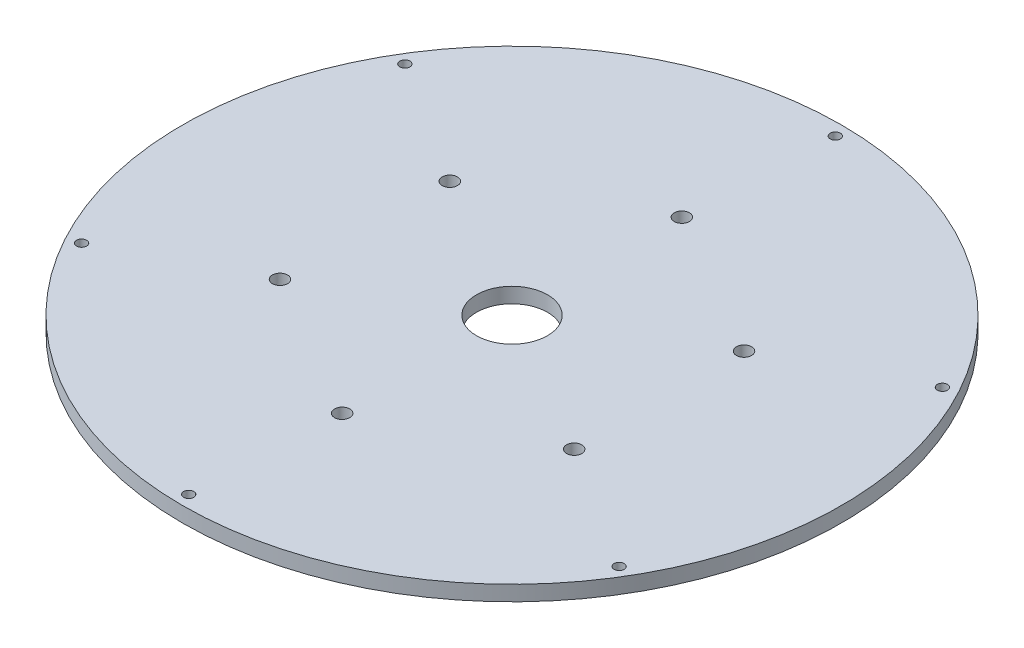
ISO-10303-21;
HEADER;
FILE_DESCRIPTION(('STEP AP214'),'2;1');
FILE_NAME('part.step','',(''),(''),'','','');
FILE_SCHEMA(('AUTOMOTIVE_DESIGN { 1 0 10303 214 1 1 1 1 }'));
ENDSEC;
DATA;
#1=APPLICATION_CONTEXT('core data for automotive mechanical design processes');
#2=APPLICATION_PROTOCOL_DEFINITION('international standard','automotive_design',2000,#1);
#3=PRODUCT_CONTEXT('',#1,'mechanical');
#4=PRODUCT('Part','Part','',(#3));
#5=PRODUCT_RELATED_PRODUCT_CATEGORY('part','',(#4));
#6=PRODUCT_DEFINITION_FORMATION('','',#4);
#7=PRODUCT_DEFINITION_CONTEXT('part definition',#1,'design');
#8=PRODUCT_DEFINITION('design','',#6,#7);
#9=PRODUCT_DEFINITION_SHAPE('','',#8);
#10=(LENGTH_UNIT() NAMED_UNIT(*) SI_UNIT(.MILLI.,.METRE.));
#11=(NAMED_UNIT(*) PLANE_ANGLE_UNIT() SI_UNIT($,.RADIAN.));
#12=(NAMED_UNIT(*) SI_UNIT($,.STERADIAN.) SOLID_ANGLE_UNIT());
#13=UNCERTAINTY_MEASURE_WITH_UNIT(LENGTH_MEASURE(1.E-05),#10,'distance_accuracy_value','');
#14=(GEOMETRIC_REPRESENTATION_CONTEXT(3) GLOBAL_UNCERTAINTY_ASSIGNED_CONTEXT((#13)) GLOBAL_UNIT_ASSIGNED_CONTEXT((#10,
#11,#12)) REPRESENTATION_CONTEXT('',''));
#15=CARTESIAN_POINT('',(0.,0.,0.));
#16=DIRECTION('',(0.,0.,1.));
#17=DIRECTION('',(1.,0.,0.));
#18=AXIS2_PLACEMENT_3D('',#15,#16,#17);
#19=CARTESIAN_POINT('',(0.,3.,0.));
#20=DIRECTION('',(0.,-1.,0.));
#21=DIRECTION('',(0.,0.,-1.));
#22=AXIS2_PLACEMENT_3D('',#19,#20,#21);
#23=CYLINDRICAL_SURFACE('',#22,65.);
#24=CARTESIAN_POINT('',(0.,3.,0.));
#25=DIRECTION('',(0.,1.,0.));
#26=DIRECTION('',(0.,0.,1.));
#27=AXIS2_PLACEMENT_3D('',#24,#25,#26);
#28=CIRCLE('',#27,65.);
#29=CARTESIAN_POINT('',(0.,3.,65.));
#30=VERTEX_POINT('',#29);
#31=EDGE_CURVE('E10',#30,#30,#28,.T.);
#32=ORIENTED_EDGE('',*,*,#31,.F.);
#33=EDGE_LOOP('',(#32));
#34=FACE_BOUND('',#33,.T.);
#35=CARTESIAN_POINT('',(0.,0.,0.));
#36=DIRECTION('',(0.,1.,0.));
#37=DIRECTION('',(0.,0.,1.));
#38=AXIS2_PLACEMENT_3D('',#35,#36,#37);
#39=CIRCLE('',#38,65.);
#40=CARTESIAN_POINT('',(0.,0.,65.));
#41=VERTEX_POINT('',#40);
#42=EDGE_CURVE('E37',#41,#41,#39,.T.);
#43=ORIENTED_EDGE('',*,*,#42,.T.);
#44=EDGE_LOOP('',(#43));
#45=FACE_BOUND('',#44,.T.);
#46=ADVANCED_FACE('F30',(#34,#45),#23,.T.);
#47=CARTESIAN_POINT('',(0.,3.,0.));
#48=DIRECTION('',(0.,1.,0.));
#49=DIRECTION('',(0.,0.,1.));
#50=AXIS2_PLACEMENT_3D('',#47,#48,#49);
#51=PLANE('',#50);
#52=CARTESIAN_POINT('',(-29.0118510267787,3.,-16.75));
#53=DIRECTION('',(0.,1.,0.));
#54=DIRECTION('',(0.,0.,1.));
#55=AXIS2_PLACEMENT_3D('',#52,#53,#54);
#56=CIRCLE('',#55,1.5);
#57=CARTESIAN_POINT('',(-29.0118510267787,3.,-15.25));
#58=VERTEX_POINT('',#57);
#59=EDGE_CURVE('E76',#58,#58,#56,.T.);
#60=ORIENTED_EDGE('',*,*,#59,.F.);
#61=EDGE_LOOP('',(#60));
#62=FACE_BOUND('',#61,.T.);
#63=CARTESIAN_POINT('',(-29.0118510267787,3.,16.75));
#64=DIRECTION('',(0.,1.,0.));
#65=DIRECTION('',(0.,0.,1.));
#66=AXIS2_PLACEMENT_3D('',#63,#64,#65);
#67=CIRCLE('',#66,1.5);
#68=CARTESIAN_POINT('',(-29.0118510267787,3.,18.25));
#69=VERTEX_POINT('',#68);
#70=EDGE_CURVE('E66',#69,#69,#67,.T.);
#71=ORIENTED_EDGE('',*,*,#70,.F.);
#72=EDGE_LOOP('',(#71));
#73=FACE_BOUND('',#72,.T.);
#74=CARTESIAN_POINT('',(0.,3.,33.5));
#75=DIRECTION('',(0.,1.,0.));
#76=DIRECTION('',(0.,0.,1.));
#77=AXIS2_PLACEMENT_3D('',#74,#75,#76);
#78=CIRCLE('',#77,1.5);
#79=CARTESIAN_POINT('',(0.,3.,35.));
#80=VERTEX_POINT('',#79);
#81=EDGE_CURVE('E63',#80,#80,#78,.T.);
#82=ORIENTED_EDGE('',*,*,#81,.F.);
#83=EDGE_LOOP('',(#82));
#84=FACE_BOUND('',#83,.T.);
#85=CARTESIAN_POINT('',(29.0118510267787,3.,16.75));
#86=DIRECTION('',(0.,1.,0.));
#87=DIRECTION('',(0.,0.,1.));
#88=AXIS2_PLACEMENT_3D('',#85,#86,#87);
#89=CIRCLE('',#88,1.5);
#90=CARTESIAN_POINT('',(29.0118510267787,3.,18.25));
#91=VERTEX_POINT('',#90);
#92=EDGE_CURVE('E60',#91,#91,#89,.T.);
#93=ORIENTED_EDGE('',*,*,#92,.F.);
#94=EDGE_LOOP('',(#93));
#95=FACE_BOUND('',#94,.T.);
#96=CARTESIAN_POINT('',(29.0118510267787,3.,-16.75));
#97=DIRECTION('',(0.,1.,0.));
#98=DIRECTION('',(0.,0.,1.));
#99=AXIS2_PLACEMENT_3D('',#96,#97,#98);
#100=CIRCLE('',#99,1.5);
#101=CARTESIAN_POINT('',(29.0118510267787,3.,-15.25));
#102=VERTEX_POINT('',#101);
#103=EDGE_CURVE('E56',#102,#102,#100,.T.);
#104=ORIENTED_EDGE('',*,*,#103,.F.);
#105=EDGE_LOOP('',(#104));
#106=FACE_BOUND('',#105,.T.);
#107=CARTESIAN_POINT('',(0.,3.,-33.5));
#108=DIRECTION('',(0.,1.,0.));
#109=DIRECTION('',(0.,0.,1.));
#110=AXIS2_PLACEMENT_3D('',#107,#108,#109);
#111=CIRCLE('',#110,1.5);
#112=CARTESIAN_POINT('',(0.,3.,-32.));
#113=VERTEX_POINT('',#112);
#114=EDGE_CURVE('E52',#113,#113,#111,.T.);
#115=ORIENTED_EDGE('',*,*,#114,.F.);
#116=EDGE_LOOP('',(#115));
#117=FACE_BOUND('',#116,.T.);
#118=CARTESIAN_POINT('',(0.,3.,0.));
#119=DIRECTION('',(0.,1.,0.));
#120=DIRECTION('',(0.,0.,1.));
#121=AXIS2_PLACEMENT_3D('',#118,#119,#120);
#122=CIRCLE('',#121,7.);
#123=CARTESIAN_POINT('',(0.,3.,7.));
#124=VERTEX_POINT('',#123);
#125=EDGE_CURVE('E51',#124,#124,#122,.T.);
#126=ORIENTED_EDGE('',*,*,#125,.F.);
#127=EDGE_LOOP('',(#126));
#128=FACE_BOUND('',#127,.T.);
#129=CARTESIAN_POINT('',(1.27880200091845,3.,-62.4869159540015));
#130=DIRECTION('',(0.,1.,0.));
#131=DIRECTION('',(0.,0.,1.));
#132=AXIS2_PLACEMENT_3D('',#129,#130,#131);
#133=CIRCLE('',#132,1.);
#134=CARTESIAN_POINT('',(1.27880200091845,3.,-61.4869159540015));
#135=VERTEX_POINT('',#134);
#136=EDGE_CURVE('E88',#135,#135,#133,.T.);
#137=ORIENTED_EDGE('',*,*,#136,.F.);
#138=EDGE_LOOP('',(#137));
#139=FACE_BOUND('',#138,.T.);
#140=CARTESIAN_POINT('',(54.7546576207677,3.,-30.135982957795));
#141=DIRECTION('',(0.,1.,0.));
#142=DIRECTION('',(0.,0.,1.));
#143=AXIS2_PLACEMENT_3D('',#140,#141,#142);
#144=CIRCLE('',#143,0.999999999999998);
#145=CARTESIAN_POINT('',(54.7546576207677,3.,-29.135982957795));
#146=VERTEX_POINT('',#145);
#147=EDGE_CURVE('E94',#146,#146,#144,.T.);
#148=ORIENTED_EDGE('',*,*,#147,.F.);
#149=EDGE_LOOP('',(#148));
#150=FACE_BOUND('',#149,.T.);
#151=CARTESIAN_POINT('',(53.4758556198492,3.,32.3509329962065));
#152=DIRECTION('',(0.,1.,0.));
#153=DIRECTION('',(0.,0.,1.));
#154=AXIS2_PLACEMENT_3D('',#151,#152,#153);
#155=CIRCLE('',#154,0.999999999999998);
#156=CARTESIAN_POINT('',(53.4758556198492,3.,33.3509329962065));
#157=VERTEX_POINT('',#156);
#158=EDGE_CURVE('E100',#157,#157,#155,.T.);
#159=ORIENTED_EDGE('',*,*,#158,.F.);
#160=EDGE_LOOP('',(#159));
#161=FACE_BOUND('',#160,.T.);
#162=CARTESIAN_POINT('',(-1.27880200091843,3.,62.4869159540015));
#163=DIRECTION('',(0.,1.,0.));
#164=DIRECTION('',(0.,0.,1.));
#165=AXIS2_PLACEMENT_3D('',#162,#163,#164);
#166=CIRCLE('',#165,1.);
#167=CARTESIAN_POINT('',(-1.27880200091843,3.,63.4869159540015));
#168=VERTEX_POINT('',#167);
#169=EDGE_CURVE('E106',#168,#168,#166,.T.);
#170=ORIENTED_EDGE('',*,*,#169,.F.);
#171=EDGE_LOOP('',(#170));
#172=FACE_BOUND('',#171,.T.);
#173=CARTESIAN_POINT('',(-54.7546576207676,3.,30.135982957795));
#174=DIRECTION('',(0.,1.,0.));
#175=DIRECTION('',(0.,0.,1.));
#176=AXIS2_PLACEMENT_3D('',#173,#174,#175);
#177=CIRCLE('',#176,0.999999999999998);
#178=CARTESIAN_POINT('',(-54.7546576207676,3.,31.135982957795));
#179=VERTEX_POINT('',#178);
#180=EDGE_CURVE('E112',#179,#179,#177,.T.);
#181=ORIENTED_EDGE('',*,*,#180,.F.);
#182=EDGE_LOOP('',(#181));
#183=FACE_BOUND('',#182,.T.);
#184=CARTESIAN_POINT('',(-53.4758556198492,3.,-32.3509329962065));
#185=DIRECTION('',(0.,1.,0.));
#186=DIRECTION('',(0.,0.,1.));
#187=AXIS2_PLACEMENT_3D('',#184,#185,#186);
#188=CIRCLE('',#187,0.999999999999998);
#189=CARTESIAN_POINT('',(-53.4758556198492,3.,-31.3509329962065));
#190=VERTEX_POINT('',#189);
#191=EDGE_CURVE('E45',#190,#190,#188,.T.);
#192=ORIENTED_EDGE('',*,*,#191,.F.);
#193=EDGE_LOOP('',(#192));
#194=FACE_BOUND('',#193,.T.);
#195=ORIENTED_EDGE('',*,*,#31,.T.);
#196=EDGE_LOOP('',(#195));
#197=FACE_BOUND('',#196,.T.);
#198=ADVANCED_FACE('F127',(#62,#73,#84,#95,#106,#117,#128,#139,#150,#161,#172,#183,#194,#197),
#51,.T.);
#199=CARTESIAN_POINT('',(0.,0.,0.));
#200=DIRECTION('',(0.,1.,0.));
#201=DIRECTION('',(0.,0.,1.));
#202=AXIS2_PLACEMENT_3D('',#199,#200,#201);
#203=PLANE('',#202);
#204=CARTESIAN_POINT('',(-29.0118510267787,0.,-16.75));
#205=DIRECTION('',(0.,1.,0.));
#206=DIRECTION('',(0.,0.,1.));
#207=AXIS2_PLACEMENT_3D('',#204,#205,#206);
#208=CIRCLE('',#207,1.5);
#209=CARTESIAN_POINT('',(-29.0118510267787,0.,-15.25));
#210=VERTEX_POINT('',#209);
#211=EDGE_CURVE('E33',#210,#210,#208,.T.);
#212=ORIENTED_EDGE('',*,*,#211,.T.);
#213=EDGE_LOOP('',(#212));
#214=FACE_BOUND('',#213,.T.);
#215=CARTESIAN_POINT('',(-29.0118510267787,0.,16.75));
#216=DIRECTION('',(0.,1.,0.));
#217=DIRECTION('',(0.,0.,1.));
#218=AXIS2_PLACEMENT_3D('',#215,#216,#217);
#219=CIRCLE('',#218,1.5);
#220=CARTESIAN_POINT('',(-29.0118510267787,0.,18.25));
#221=VERTEX_POINT('',#220);
#222=EDGE_CURVE('E64',#221,#221,#219,.T.);
#223=ORIENTED_EDGE('',*,*,#222,.T.);
#224=EDGE_LOOP('',(#223));
#225=FACE_BOUND('',#224,.T.);
#226=CARTESIAN_POINT('',(0.,0.,33.5));
#227=DIRECTION('',(0.,1.,0.));
#228=DIRECTION('',(0.,0.,1.));
#229=AXIS2_PLACEMENT_3D('',#226,#227,#228);
#230=CIRCLE('',#229,1.5);
#231=CARTESIAN_POINT('',(0.,0.,35.));
#232=VERTEX_POINT('',#231);
#233=EDGE_CURVE('E61',#232,#232,#230,.T.);
#234=ORIENTED_EDGE('',*,*,#233,.T.);
#235=EDGE_LOOP('',(#234));
#236=FACE_BOUND('',#235,.T.);
#237=CARTESIAN_POINT('',(29.0118510267787,0.,16.75));
#238=DIRECTION('',(0.,1.,0.));
#239=DIRECTION('',(0.,0.,1.));
#240=AXIS2_PLACEMENT_3D('',#237,#238,#239);
#241=CIRCLE('',#240,1.5);
#242=CARTESIAN_POINT('',(29.0118510267787,0.,18.25));
#243=VERTEX_POINT('',#242);
#244=EDGE_CURVE('E57',#243,#243,#241,.T.);
#245=ORIENTED_EDGE('',*,*,#244,.T.);
#246=EDGE_LOOP('',(#245));
#247=FACE_BOUND('',#246,.T.);
#248=CARTESIAN_POINT('',(29.0118510267787,0.,-16.75));
#249=DIRECTION('',(0.,1.,0.));
#250=DIRECTION('',(0.,0.,1.));
#251=AXIS2_PLACEMENT_3D('',#248,#249,#250);
#252=CIRCLE('',#251,1.5);
#253=CARTESIAN_POINT('',(29.0118510267787,0.,-15.25));
#254=VERTEX_POINT('',#253);
#255=EDGE_CURVE('E53',#254,#254,#252,.T.);
#256=ORIENTED_EDGE('',*,*,#255,.T.);
#257=EDGE_LOOP('',(#256));
#258=FACE_BOUND('',#257,.T.);
#259=CARTESIAN_POINT('',(0.,0.,-33.5));
#260=DIRECTION('',(0.,1.,0.));
#261=DIRECTION('',(0.,0.,1.));
#262=AXIS2_PLACEMENT_3D('',#259,#260,#261);
#263=CIRCLE('',#262,1.5);
#264=CARTESIAN_POINT('',(0.,0.,-32.));
#265=VERTEX_POINT('',#264);
#266=EDGE_CURVE('E48',#265,#265,#263,.T.);
#267=ORIENTED_EDGE('',*,*,#266,.T.);
#268=EDGE_LOOP('',(#267));
#269=FACE_BOUND('',#268,.T.);
#270=CARTESIAN_POINT('',(0.,0.,0.));
#271=DIRECTION('',(0.,1.,0.));
#272=DIRECTION('',(0.,0.,1.));
#273=AXIS2_PLACEMENT_3D('',#270,#271,#272);
#274=CIRCLE('',#273,7.);
#275=CARTESIAN_POINT('',(0.,0.,7.));
#276=VERTEX_POINT('',#275);
#277=EDGE_CURVE('E85',#276,#276,#274,.T.);
#278=ORIENTED_EDGE('',*,*,#277,.T.);
#279=EDGE_LOOP('',(#278));
#280=FACE_BOUND('',#279,.T.);
#281=CARTESIAN_POINT('',(1.27880200091845,0.,-62.4869159540015));
#282=DIRECTION('',(0.,1.,0.));
#283=DIRECTION('',(0.,0.,1.));
#284=AXIS2_PLACEMENT_3D('',#281,#282,#283);
#285=CIRCLE('',#284,1.);
#286=CARTESIAN_POINT('',(1.27880200091845,0.,-61.4869159540015));
#287=VERTEX_POINT('',#286);
#288=EDGE_CURVE('E91',#287,#287,#285,.T.);
#289=ORIENTED_EDGE('',*,*,#288,.T.);
#290=EDGE_LOOP('',(#289));
#291=FACE_BOUND('',#290,.T.);
#292=CARTESIAN_POINT('',(54.7546576207677,0.,-30.135982957795));
#293=DIRECTION('',(0.,1.,0.));
#294=DIRECTION('',(0.,0.,1.));
#295=AXIS2_PLACEMENT_3D('',#292,#293,#294);
#296=CIRCLE('',#295,0.999999999999998);
#297=CARTESIAN_POINT('',(54.7546576207677,0.,-29.135982957795));
#298=VERTEX_POINT('',#297);
#299=EDGE_CURVE('E97',#298,#298,#296,.T.);
#300=ORIENTED_EDGE('',*,*,#299,.T.);
#301=EDGE_LOOP('',(#300));
#302=FACE_BOUND('',#301,.T.);
#303=CARTESIAN_POINT('',(53.4758556198492,0.,32.3509329962065));
#304=DIRECTION('',(0.,1.,0.));
#305=DIRECTION('',(0.,0.,1.));
#306=AXIS2_PLACEMENT_3D('',#303,#304,#305);
#307=CIRCLE('',#306,0.999999999999998);
#308=CARTESIAN_POINT('',(53.4758556198492,0.,33.3509329962065));
#309=VERTEX_POINT('',#308);
#310=EDGE_CURVE('E103',#309,#309,#307,.T.);
#311=ORIENTED_EDGE('',*,*,#310,.T.);
#312=EDGE_LOOP('',(#311));
#313=FACE_BOUND('',#312,.T.);
#314=CARTESIAN_POINT('',(-1.27880200091843,0.,62.4869159540015));
#315=DIRECTION('',(0.,1.,0.));
#316=DIRECTION('',(0.,0.,1.));
#317=AXIS2_PLACEMENT_3D('',#314,#315,#316);
#318=CIRCLE('',#317,1.);
#319=CARTESIAN_POINT('',(-1.27880200091843,0.,63.4869159540015));
#320=VERTEX_POINT('',#319);
#321=EDGE_CURVE('E109',#320,#320,#318,.T.);
#322=ORIENTED_EDGE('',*,*,#321,.T.);
#323=EDGE_LOOP('',(#322));
#324=FACE_BOUND('',#323,.T.);
#325=CARTESIAN_POINT('',(-54.7546576207676,0.,30.135982957795));
#326=DIRECTION('',(0.,1.,0.));
#327=DIRECTION('',(0.,0.,1.));
#328=AXIS2_PLACEMENT_3D('',#325,#326,#327);
#329=CIRCLE('',#328,0.999999999999998);
#330=CARTESIAN_POINT('',(-54.7546576207676,0.,31.135982957795));
#331=VERTEX_POINT('',#330);
#332=EDGE_CURVE('E115',#331,#331,#329,.T.);
#333=ORIENTED_EDGE('',*,*,#332,.T.);
#334=EDGE_LOOP('',(#333));
#335=FACE_BOUND('',#334,.T.);
#336=CARTESIAN_POINT('',(-53.4758556198492,0.,-32.3509329962065));
#337=DIRECTION('',(0.,1.,0.));
#338=DIRECTION('',(0.,0.,1.));
#339=AXIS2_PLACEMENT_3D('',#336,#337,#338);
#340=CIRCLE('',#339,0.999999999999998);
#341=CARTESIAN_POINT('',(-53.4758556198492,0.,-31.3509329962065));
#342=VERTEX_POINT('',#341);
#343=EDGE_CURVE('E42',#342,#342,#340,.T.);
#344=ORIENTED_EDGE('',*,*,#343,.T.);
#345=EDGE_LOOP('',(#344));
#346=FACE_BOUND('',#345,.T.);
#347=ORIENTED_EDGE('',*,*,#42,.F.);
#348=EDGE_LOOP('',(#347));
#349=FACE_BOUND('',#348,.T.);
#350=ADVANCED_FACE('F129',(#214,#225,#236,#247,#258,#269,#280,#291,#302,#313,#324,#335,#346,
#349),#203,.F.);
#351=CARTESIAN_POINT('',(-53.4758556198492,0.,-32.3509329962065));
#352=DIRECTION('',(0.,1.,0.));
#353=DIRECTION('',(0.,0.,1.));
#354=AXIS2_PLACEMENT_3D('',#351,#352,#353);
#355=CYLINDRICAL_SURFACE('',#354,0.999999999999998);
#356=ORIENTED_EDGE('',*,*,#343,.F.);
#357=EDGE_LOOP('',(#356));
#358=FACE_BOUND('',#357,.T.);
#359=ORIENTED_EDGE('',*,*,#191,.T.);
#360=EDGE_LOOP('',(#359));
#361=FACE_BOUND('',#360,.T.);
#362=ADVANCED_FACE('F125',(#358,#361),#355,.F.);
#363=CARTESIAN_POINT('',(-54.7546576207676,0.,30.135982957795));
#364=DIRECTION('',(0.,1.,0.));
#365=DIRECTION('',(0.,0.,1.));
#366=AXIS2_PLACEMENT_3D('',#363,#364,#365);
#367=CYLINDRICAL_SURFACE('',#366,0.999999999999998);
#368=ORIENTED_EDGE('',*,*,#332,.F.);
#369=EDGE_LOOP('',(#368));
#370=FACE_BOUND('',#369,.T.);
#371=ORIENTED_EDGE('',*,*,#180,.T.);
#372=EDGE_LOOP('',(#371));
#373=FACE_BOUND('',#372,.T.);
#374=ADVANCED_FACE('F143',(#370,#373),#367,.F.);
#375=CARTESIAN_POINT('',(-1.27880200091843,0.,62.4869159540015));
#376=DIRECTION('',(0.,1.,0.));
#377=DIRECTION('',(0.,0.,1.));
#378=AXIS2_PLACEMENT_3D('',#375,#376,#377);
#379=CYLINDRICAL_SURFACE('',#378,1.);
#380=ORIENTED_EDGE('',*,*,#321,.F.);
#381=EDGE_LOOP('',(#380));
#382=FACE_BOUND('',#381,.T.);
#383=ORIENTED_EDGE('',*,*,#169,.T.);
#384=EDGE_LOOP('',(#383));
#385=FACE_BOUND('',#384,.T.);
#386=ADVANCED_FACE('F147',(#382,#385),#379,.F.);
#387=CARTESIAN_POINT('',(53.4758556198492,0.,32.3509329962065));
#388=DIRECTION('',(0.,1.,0.));
#389=DIRECTION('',(0.,0.,1.));
#390=AXIS2_PLACEMENT_3D('',#387,#388,#389);
#391=CYLINDRICAL_SURFACE('',#390,0.999999999999998);
#392=ORIENTED_EDGE('',*,*,#310,.F.);
#393=EDGE_LOOP('',(#392));
#394=FACE_BOUND('',#393,.T.);
#395=ORIENTED_EDGE('',*,*,#158,.T.);
#396=EDGE_LOOP('',(#395));
#397=FACE_BOUND('',#396,.T.);
#398=ADVANCED_FACE('F151',(#394,#397),#391,.F.);
#399=CARTESIAN_POINT('',(54.7546576207677,0.,-30.135982957795));
#400=DIRECTION('',(0.,1.,0.));
#401=DIRECTION('',(0.,0.,1.));
#402=AXIS2_PLACEMENT_3D('',#399,#400,#401);
#403=CYLINDRICAL_SURFACE('',#402,0.999999999999998);
#404=ORIENTED_EDGE('',*,*,#299,.F.);
#405=EDGE_LOOP('',(#404));
#406=FACE_BOUND('',#405,.T.);
#407=ORIENTED_EDGE('',*,*,#147,.T.);
#408=EDGE_LOOP('',(#407));
#409=FACE_BOUND('',#408,.T.);
#410=ADVANCED_FACE('F155',(#406,#409),#403,.F.);
#411=CARTESIAN_POINT('',(1.27880200091845,0.,-62.4869159540015));
#412=DIRECTION('',(0.,1.,0.));
#413=DIRECTION('',(0.,0.,1.));
#414=AXIS2_PLACEMENT_3D('',#411,#412,#413);
#415=CYLINDRICAL_SURFACE('',#414,1.);
#416=ORIENTED_EDGE('',*,*,#288,.F.);
#417=EDGE_LOOP('',(#416));
#418=FACE_BOUND('',#417,.T.);
#419=ORIENTED_EDGE('',*,*,#136,.T.);
#420=EDGE_LOOP('',(#419));
#421=FACE_BOUND('',#420,.T.);
#422=ADVANCED_FACE('F159',(#418,#421),#415,.F.);
#423=CARTESIAN_POINT('',(0.,0.,0.));
#424=DIRECTION('',(0.,1.,0.));
#425=DIRECTION('',(0.,0.,1.));
#426=AXIS2_PLACEMENT_3D('',#423,#424,#425);
#427=CYLINDRICAL_SURFACE('',#426,7.);
#428=ORIENTED_EDGE('',*,*,#277,.F.);
#429=EDGE_LOOP('',(#428));
#430=FACE_BOUND('',#429,.T.);
#431=ORIENTED_EDGE('',*,*,#125,.T.);
#432=EDGE_LOOP('',(#431));
#433=FACE_BOUND('',#432,.T.);
#434=ADVANCED_FACE('F163',(#430,#433),#427,.F.);
#435=CARTESIAN_POINT('',(0.,-1.,-33.5));
#436=DIRECTION('',(0.,1.,0.));
#437=DIRECTION('',(0.,0.,1.));
#438=AXIS2_PLACEMENT_3D('',#435,#436,#437);
#439=CYLINDRICAL_SURFACE('',#438,1.5);
#440=ORIENTED_EDGE('',*,*,#114,.T.);
#441=EDGE_LOOP('',(#440));
#442=FACE_BOUND('',#441,.T.);
#443=ORIENTED_EDGE('',*,*,#266,.F.);
#444=EDGE_LOOP('',(#443));
#445=FACE_BOUND('',#444,.T.);
#446=ADVANCED_FACE('F167',(#442,#445),#439,.F.);
#447=CARTESIAN_POINT('',(29.0118510267787,-1.,-16.75));
#448=DIRECTION('',(0.,1.,0.));
#449=DIRECTION('',(0.,0.,1.));
#450=AXIS2_PLACEMENT_3D('',#447,#448,#449);
#451=CYLINDRICAL_SURFACE('',#450,1.5);
#452=ORIENTED_EDGE('',*,*,#103,.T.);
#453=EDGE_LOOP('',(#452));
#454=FACE_BOUND('',#453,.T.);
#455=ORIENTED_EDGE('',*,*,#255,.F.);
#456=EDGE_LOOP('',(#455));
#457=FACE_BOUND('',#456,.T.);
#458=ADVANCED_FACE('F171',(#454,#457),#451,.F.);
#459=CARTESIAN_POINT('',(29.0118510267787,-1.,16.75));
#460=DIRECTION('',(0.,1.,0.));
#461=DIRECTION('',(0.,0.,1.));
#462=AXIS2_PLACEMENT_3D('',#459,#460,#461);
#463=CYLINDRICAL_SURFACE('',#462,1.5);
#464=ORIENTED_EDGE('',*,*,#92,.T.);
#465=EDGE_LOOP('',(#464));
#466=FACE_BOUND('',#465,.T.);
#467=ORIENTED_EDGE('',*,*,#244,.F.);
#468=EDGE_LOOP('',(#467));
#469=FACE_BOUND('',#468,.T.);
#470=ADVANCED_FACE('F175',(#466,#469),#463,.F.);
#471=CARTESIAN_POINT('',(0.,-1.,33.5));
#472=DIRECTION('',(0.,1.,0.));
#473=DIRECTION('',(0.,0.,1.));
#474=AXIS2_PLACEMENT_3D('',#471,#472,#473);
#475=CYLINDRICAL_SURFACE('',#474,1.5);
#476=ORIENTED_EDGE('',*,*,#81,.T.);
#477=EDGE_LOOP('',(#476));
#478=FACE_BOUND('',#477,.T.);
#479=ORIENTED_EDGE('',*,*,#233,.F.);
#480=EDGE_LOOP('',(#479));
#481=FACE_BOUND('',#480,.T.);
#482=ADVANCED_FACE('F179',(#478,#481),#475,.F.);
#483=CARTESIAN_POINT('',(-29.0118510267787,-1.,16.75));
#484=DIRECTION('',(0.,1.,0.));
#485=DIRECTION('',(0.,0.,1.));
#486=AXIS2_PLACEMENT_3D('',#483,#484,#485);
#487=CYLINDRICAL_SURFACE('',#486,1.5);
#488=ORIENTED_EDGE('',*,*,#70,.T.);
#489=EDGE_LOOP('',(#488));
#490=FACE_BOUND('',#489,.T.);
#491=ORIENTED_EDGE('',*,*,#222,.F.);
#492=EDGE_LOOP('',(#491));
#493=FACE_BOUND('',#492,.T.);
#494=ADVANCED_FACE('F183',(#490,#493),#487,.F.);
#495=CARTESIAN_POINT('',(-29.0118510267787,-1.,-16.75));
#496=DIRECTION('',(0.,1.,0.));
#497=DIRECTION('',(0.,0.,1.));
#498=AXIS2_PLACEMENT_3D('',#495,#496,#497);
#499=CYLINDRICAL_SURFACE('',#498,1.5);
#500=ORIENTED_EDGE('',*,*,#59,.T.);
#501=EDGE_LOOP('',(#500));
#502=FACE_BOUND('',#501,.T.);
#503=ORIENTED_EDGE('',*,*,#211,.F.);
#504=EDGE_LOOP('',(#503));
#505=FACE_BOUND('',#504,.T.);
#506=ADVANCED_FACE('F187',(#502,#505),#499,.F.);
#507=CLOSED_SHELL('',(#46,#198,#350,#362,#374,#386,#398,#410,#422,#434,#446,#458,#470,#482,#494,#506));
#508=MANIFOLD_SOLID_BREP('B2',#507);
#509=ADVANCED_BREP_SHAPE_REPRESENTATION('',(#18,#508),#14);
#510=SHAPE_DEFINITION_REPRESENTATION(#9,#509);
ENDSEC;
END-ISO-10303-21;
